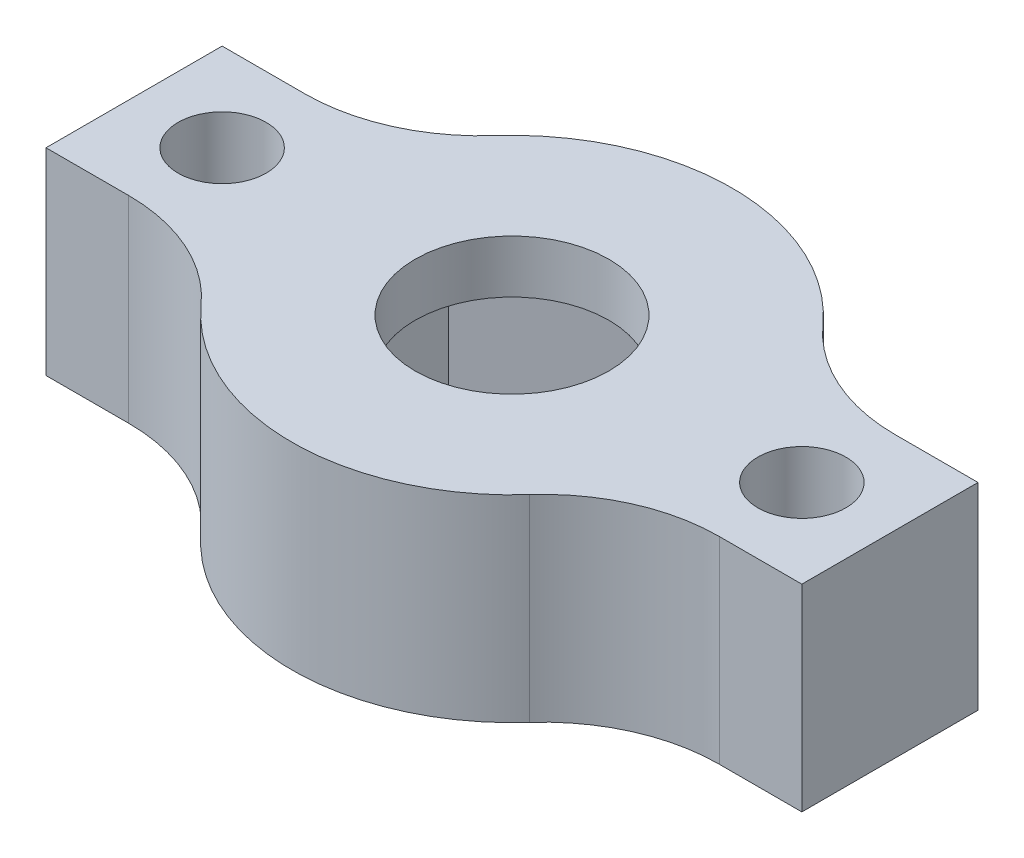
ISO-10303-21;
HEADER;
FILE_DESCRIPTION(('STEP AP214'),'2;1');
FILE_NAME('part.step','',(''),(''),'','','');
FILE_SCHEMA(('AUTOMOTIVE_DESIGN { 1 0 10303 214 1 1 1 1 }'));
ENDSEC;
DATA;
#1=APPLICATION_CONTEXT('core data for automotive mechanical design processes');
#2=APPLICATION_PROTOCOL_DEFINITION('international standard','automotive_design',2000,#1);
#3=PRODUCT_CONTEXT('',#1,'mechanical');
#4=PRODUCT('Part','Part','',(#3));
#5=PRODUCT_RELATED_PRODUCT_CATEGORY('part','',(#4));
#6=PRODUCT_DEFINITION_FORMATION('','',#4);
#7=PRODUCT_DEFINITION_CONTEXT('part definition',#1,'design');
#8=PRODUCT_DEFINITION('design','',#6,#7);
#9=PRODUCT_DEFINITION_SHAPE('','',#8);
#10=(LENGTH_UNIT() NAMED_UNIT(*) SI_UNIT(.MILLI.,.METRE.));
#11=(NAMED_UNIT(*) PLANE_ANGLE_UNIT() SI_UNIT($,.RADIAN.));
#12=(NAMED_UNIT(*) SI_UNIT($,.STERADIAN.) SOLID_ANGLE_UNIT());
#13=UNCERTAINTY_MEASURE_WITH_UNIT(LENGTH_MEASURE(1.E-05),#10,'distance_accuracy_value','');
#14=(GEOMETRIC_REPRESENTATION_CONTEXT(3) GLOBAL_UNCERTAINTY_ASSIGNED_CONTEXT((#13)) GLOBAL_UNIT_ASSIGNED_CONTEXT((#10,
#11,#12)) REPRESENTATION_CONTEXT('',''));
#15=CARTESIAN_POINT('',(0.,0.,0.));
#16=DIRECTION('',(0.,0.,1.));
#17=DIRECTION('',(1.,0.,0.));
#18=AXIS2_PLACEMENT_3D('',#15,#16,#17);
#19=CARTESIAN_POINT('',(0.,8.2,0.));
#20=DIRECTION('',(0.,-1.,0.));
#21=DIRECTION('',(0.,0.,-1.));
#22=AXIS2_PLACEMENT_3D('',#19,#20,#21);
#23=CYLINDRICAL_SURFACE('',#22,12.5);
#24=CARTESIAN_POINT('',(0.,11.2,0.));
#25=DIRECTION('',(0.,1.,0.));
#26=DIRECTION('',(0.,0.,1.));
#27=AXIS2_PLACEMENT_3D('',#24,#25,#26);
#28=CIRCLE('',#27,12.5);
#29=CARTESIAN_POINT('',(9.31694990624912,11.2,-8.33333333333333));
#30=VERTEX_POINT('',#29);
#31=CARTESIAN_POINT('',(-9.31694990624912,11.2,-8.33333333333334));
#32=VERTEX_POINT('',#31);
#33=EDGE_CURVE('E213',#30,#32,#28,.T.);
#34=ORIENTED_EDGE('',*,*,#33,.F.);
#35=DIRECTION('',(0.,-1.,0.));
#36=VECTOR('',#35,1.);
#37=CARTESIAN_POINT('',(9.31694990624912,8.2,-8.33333333333333));
#38=LINE('',#37,#36);
#39=CARTESIAN_POINT('',(9.31694990624912,0.,-8.33333333333333));
#40=VERTEX_POINT('',#39);
#41=EDGE_CURVE('E270',#30,#40,#38,.T.);
#42=ORIENTED_EDGE('',*,*,#41,.T.);
#43=CARTESIAN_POINT('',(0.,0.,0.));
#44=DIRECTION('',(0.,1.,0.));
#45=DIRECTION('',(0.,0.,1.));
#46=AXIS2_PLACEMENT_3D('',#43,#44,#45);
#47=CIRCLE('',#46,12.5);
#48=CARTESIAN_POINT('',(-9.31694990624912,0.,-8.33333333333334));
#49=VERTEX_POINT('',#48);
#50=EDGE_CURVE('E267',#40,#49,#47,.T.);
#51=ORIENTED_EDGE('',*,*,#50,.T.);
#52=DIRECTION('',(0.,-1.,0.));
#53=VECTOR('',#52,1.);
#54=CARTESIAN_POINT('',(-9.31694990624912,8.2,-8.33333333333334));
#55=LINE('',#54,#53);
#56=EDGE_CURVE('E268',#49,#32,#55,.F.);
#57=ORIENTED_EDGE('',*,*,#56,.T.);
#58=EDGE_LOOP('',(#34,#42,#51,#57));
#59=FACE_BOUND('',#58,.T.);
#60=ADVANCED_FACE('F31',(#59),#23,.T.);
#61=CARTESIAN_POINT('',(0.,0.,0.));
#62=DIRECTION('',(0.,1.,0.));
#63=DIRECTION('',(0.,0.,1.));
#64=AXIS2_PLACEMENT_3D('',#61,#62,#63);
#65=PLANE('',#64);
#66=CARTESIAN_POINT('',(-16.4564392373896,0.,0.));
#67=DIRECTION('',(0.,1.,0.));
#68=DIRECTION('',(0.,0.,1.));
#69=AXIS2_PLACEMENT_3D('',#66,#67,#68);
#70=CIRCLE('',#69,2.5);
#71=CARTESIAN_POINT('',(-16.4564392373896,0.,2.5));
#72=VERTEX_POINT('',#71);
#73=EDGE_CURVE('E334',#72,#72,#70,.T.);
#74=ORIENTED_EDGE('',*,*,#73,.T.);
#75=EDGE_LOOP('',(#74));
#76=FACE_BOUND('',#75,.T.);
#77=CARTESIAN_POINT('',(16.4564392373896,0.,0.));
#78=DIRECTION('',(0.,1.,0.));
#79=DIRECTION('',(0.,0.,1.));
#80=AXIS2_PLACEMENT_3D('',#77,#78,#79);
#81=CIRCLE('',#80,2.5);
#82=CARTESIAN_POINT('',(16.4564392373896,0.,2.5));
#83=VERTEX_POINT('',#82);
#84=EDGE_CURVE('E329',#83,#83,#81,.T.);
#85=ORIENTED_EDGE('',*,*,#84,.T.);
#86=EDGE_LOOP('',(#85));
#87=FACE_BOUND('',#86,.T.);
#88=CARTESIAN_POINT('',(-9.31694990624912,0.,8.33333333333334));
#89=VERTEX_POINT('',#88);
#90=CARTESIAN_POINT('',(9.31694990624912,0.,8.33333333333333));
#91=VERTEX_POINT('',#90);
#92=EDGE_CURVE('E264',#89,#91,#47,.T.);
#93=ORIENTED_EDGE('',*,*,#92,.F.);
#94=CARTESIAN_POINT('',(-16.7705098312484,0.,15.));
#95=DIRECTION('',(0.,1.,0.));
#96=DIRECTION('',(0.,0.,1.));
#97=AXIS2_PLACEMENT_3D('',#94,#95,#96);
#98=CIRCLE('',#97,10.);
#99=CARTESIAN_POINT('',(-16.7705098312484,0.,5.));
#100=VERTEX_POINT('',#99);
#101=EDGE_CURVE('E293',#89,#100,#98,.T.);
#102=ORIENTED_EDGE('',*,*,#101,.T.);
#103=DIRECTION('',(-1.,0.,0.));
#104=VECTOR('',#103,1.);
#105=CARTESIAN_POINT('',(-11.4564392373896,0.,5.));
#106=LINE('',#105,#104);
#107=CARTESIAN_POINT('',(-21.4564392373896,0.,5.00000000000001));
#108=VERTEX_POINT('',#107);
#109=EDGE_CURVE('E187',#100,#108,#106,.T.);
#110=ORIENTED_EDGE('',*,*,#109,.T.);
#111=DIRECTION('',(0.,0.,-1.));
#112=VECTOR('',#111,1.);
#113=CARTESIAN_POINT('',(-21.4564392373896,0.,5.00000000000001));
#114=LINE('',#113,#112);
#115=CARTESIAN_POINT('',(-21.4564392373896,0.,-5.00000000000001));
#116=VERTEX_POINT('',#115);
#117=EDGE_CURVE('E183',#108,#116,#114,.T.);
#118=ORIENTED_EDGE('',*,*,#117,.T.);
#119=DIRECTION('',(1.,0.,0.));
#120=VECTOR('',#119,1.);
#121=CARTESIAN_POINT('',(-11.4564392373896,0.,-5.));
#122=LINE('',#121,#120);
#123=CARTESIAN_POINT('',(-16.7705098312484,0.,-5.));
#124=VERTEX_POINT('',#123);
#125=EDGE_CURVE('E174',#116,#124,#122,.T.);
#126=ORIENTED_EDGE('',*,*,#125,.T.);
#127=CARTESIAN_POINT('',(-16.7705098312484,0.,-15.));
#128=DIRECTION('',(0.,1.,0.));
#129=DIRECTION('',(0.,0.,1.));
#130=AXIS2_PLACEMENT_3D('',#127,#128,#129);
#131=CIRCLE('',#130,10.);
#132=EDGE_CURVE('E290',#124,#49,#131,.T.);
#133=ORIENTED_EDGE('',*,*,#132,.T.);
#134=ORIENTED_EDGE('',*,*,#50,.F.);
#135=CARTESIAN_POINT('',(16.7705098312484,0.,-15.));
#136=DIRECTION('',(0.,1.,0.));
#137=DIRECTION('',(0.,0.,1.));
#138=AXIS2_PLACEMENT_3D('',#135,#136,#137);
#139=CIRCLE('',#138,10.);
#140=CARTESIAN_POINT('',(16.7705098312484,0.,-5.));
#141=VERTEX_POINT('',#140);
#142=EDGE_CURVE('E286',#40,#141,#139,.T.);
#143=ORIENTED_EDGE('',*,*,#142,.T.);
#144=DIRECTION('',(1.,0.,0.));
#145=VECTOR('',#144,1.);
#146=CARTESIAN_POINT('',(11.4564392373896,0.,-5.));
#147=LINE('',#146,#145);
#148=CARTESIAN_POINT('',(21.4564392373896,0.,-5.));
#149=VERTEX_POINT('',#148);
#150=EDGE_CURVE('E191',#141,#149,#147,.T.);
#151=ORIENTED_EDGE('',*,*,#150,.T.);
#152=DIRECTION('',(0.,0.,1.));
#153=VECTOR('',#152,1.);
#154=CARTESIAN_POINT('',(21.4564392373896,0.,5.));
#155=LINE('',#154,#153);
#156=CARTESIAN_POINT('',(21.4564392373896,0.,5.));
#157=VERTEX_POINT('',#156);
#158=EDGE_CURVE('E196',#149,#157,#155,.T.);
#159=ORIENTED_EDGE('',*,*,#158,.T.);
#160=DIRECTION('',(-1.,0.,0.));
#161=VECTOR('',#160,1.);
#162=CARTESIAN_POINT('',(11.4564392373896,0.,5.));
#163=LINE('',#162,#161);
#164=CARTESIAN_POINT('',(16.7705098312484,0.,5.));
#165=VERTEX_POINT('',#164);
#166=EDGE_CURVE('E192',#157,#165,#163,.T.);
#167=ORIENTED_EDGE('',*,*,#166,.T.);
#168=CARTESIAN_POINT('',(16.7705098312484,0.,15.));
#169=DIRECTION('',(0.,1.,0.));
#170=DIRECTION('',(0.,0.,1.));
#171=AXIS2_PLACEMENT_3D('',#168,#169,#170);
#172=CIRCLE('',#171,10.);
#173=EDGE_CURVE('E39',#165,#91,#172,.T.);
#174=ORIENTED_EDGE('',*,*,#173,.T.);
#175=EDGE_LOOP('',(#93,#102,#110,#118,#126,#133,#134,#143,#151,#159,#167,#174));
#176=FACE_BOUND('',#175,.T.);
#177=DIRECTION('',(0.866025403784439,0.,-0.5));
#178=VECTOR('',#177,1.);
#179=CARTESIAN_POINT('',(0.,0.,9.81495457622364));
#180=LINE('',#179,#178);
#181=CARTESIAN_POINT('',(0.,0.,9.81495457622364));
#182=VERTEX_POINT('',#181);
#183=CARTESIAN_POINT('',(8.5,0.,4.90747728811182));
#184=VERTEX_POINT('',#183);
#185=EDGE_CURVE('E234',#182,#184,#180,.T.);
#186=ORIENTED_EDGE('',*,*,#185,.T.);
#187=DIRECTION('',(0.,0.,-1.));
#188=VECTOR('',#187,1.);
#189=CARTESIAN_POINT('',(8.5,0.,4.90747728811182));
#190=LINE('',#189,#188);
#191=CARTESIAN_POINT('',(8.5,0.,-4.90747728811182));
#192=VERTEX_POINT('',#191);
#193=EDGE_CURVE('E237',#184,#192,#190,.T.);
#194=ORIENTED_EDGE('',*,*,#193,.T.);
#195=DIRECTION('',(-0.866025403784439,0.,-0.5));
#196=VECTOR('',#195,1.);
#197=CARTESIAN_POINT('',(8.5,0.,-4.90747728811182));
#198=LINE('',#197,#196);
#199=CARTESIAN_POINT('',(0.,0.,-9.81495457622364));
#200=VERTEX_POINT('',#199);
#201=EDGE_CURVE('E240',#192,#200,#198,.T.);
#202=ORIENTED_EDGE('',*,*,#201,.T.);
#203=DIRECTION('',(-0.866025403784439,0.,0.5));
#204=VECTOR('',#203,1.);
#205=CARTESIAN_POINT('',(0.,0.,-9.81495457622364));
#206=LINE('',#205,#204);
#207=CARTESIAN_POINT('',(-8.5,0.,-4.90747728811182));
#208=VERTEX_POINT('',#207);
#209=EDGE_CURVE('E243',#200,#208,#206,.T.);
#210=ORIENTED_EDGE('',*,*,#209,.T.);
#211=DIRECTION('',(0.,0.,1.));
#212=VECTOR('',#211,1.);
#213=CARTESIAN_POINT('',(-8.5,0.,-4.90747728811182));
#214=LINE('',#213,#212);
#215=CARTESIAN_POINT('',(-8.5,0.,4.90747728811182));
#216=VERTEX_POINT('',#215);
#217=EDGE_CURVE('E246',#208,#216,#214,.T.);
#218=ORIENTED_EDGE('',*,*,#217,.T.);
#219=DIRECTION('',(0.866025403784439,0.,0.5));
#220=VECTOR('',#219,1.);
#221=CARTESIAN_POINT('',(-8.5,0.,4.90747728811182));
#222=LINE('',#221,#220);
#223=EDGE_CURVE('E218',#216,#182,#222,.T.);
#224=ORIENTED_EDGE('',*,*,#223,.T.);
#225=EDGE_LOOP('',(#186,#194,#202,#210,#218,#224));
#226=FACE_BOUND('',#225,.T.);
#227=ADVANCED_FACE('F298',(#76,#87,#176,#226),#65,.F.);
#228=CARTESIAN_POINT('',(-9.31694990624912,11.2,8.33333333333334));
#229=VERTEX_POINT('',#228);
#230=CARTESIAN_POINT('',(9.31694990624912,11.2,8.33333333333333));
#231=VERTEX_POINT('',#230);
#232=EDGE_CURVE('E204',#229,#231,#28,.T.);
#233=ORIENTED_EDGE('',*,*,#232,.F.);
#234=DIRECTION('',(0.,-1.,0.));
#235=VECTOR('',#234,1.);
#236=CARTESIAN_POINT('',(-9.31694990624912,8.2,8.33333333333334));
#237=LINE('',#236,#235);
#238=EDGE_CURVE('E279',#229,#89,#237,.T.);
#239=ORIENTED_EDGE('',*,*,#238,.T.);
#240=ORIENTED_EDGE('',*,*,#92,.T.);
#241=DIRECTION('',(0.,-1.,0.));
#242=VECTOR('',#241,1.);
#243=CARTESIAN_POINT('',(9.31694990624912,8.2,8.33333333333333));
#244=LINE('',#243,#242);
#245=EDGE_CURVE('E277',#91,#231,#244,.F.);
#246=ORIENTED_EDGE('',*,*,#245,.T.);
#247=EDGE_LOOP('',(#233,#239,#240,#246));
#248=FACE_BOUND('',#247,.T.);
#249=ADVANCED_FACE('F303',(#248),#23,.T.);
#250=CARTESIAN_POINT('',(0.,8.2,9.81495457622364));
#251=DIRECTION('',(-0.5,0.,-0.866025403784439));
#252=DIRECTION('',(-0.866025403784439,0.,0.5));
#253=AXIS2_PLACEMENT_3D('',#250,#251,#252);
#254=PLANE('',#253);
#255=ORIENTED_EDGE('',*,*,#185,.F.);
#256=DIRECTION('',(0.,-1.,0.));
#257=VECTOR('',#256,1.);
#258=CARTESIAN_POINT('',(0.,8.2,9.81495457622364));
#259=LINE('',#258,#257);
#260=CARTESIAN_POINT('',(0.,8.2,9.81495457622364));
#261=VERTEX_POINT('',#260);
#262=EDGE_CURVE('E233',#261,#182,#259,.T.);
#263=ORIENTED_EDGE('',*,*,#262,.F.);
#264=DIRECTION('',(0.866025403784439,0.,-0.5));
#265=VECTOR('',#264,1.);
#266=CARTESIAN_POINT('',(0.,8.2,9.81495457622364));
#267=LINE('',#266,#265);
#268=CARTESIAN_POINT('',(8.5,8.2,4.90747728811182));
#269=VERTEX_POINT('',#268);
#270=EDGE_CURVE('E214',#261,#269,#267,.T.);
#271=ORIENTED_EDGE('',*,*,#270,.T.);
#272=DIRECTION('',(0.,-1.,0.));
#273=VECTOR('',#272,1.);
#274=CARTESIAN_POINT('',(8.5,8.2,4.90747728811182));
#275=LINE('',#274,#273);
#276=EDGE_CURVE('E261',#269,#184,#275,.T.);
#277=ORIENTED_EDGE('',*,*,#276,.T.);
#278=EDGE_LOOP('',(#255,#263,#271,#277));
#279=FACE_BOUND('',#278,.T.);
#280=ADVANCED_FACE('F383',(#279),#254,.T.);
#281=CARTESIAN_POINT('',(8.5,8.2,4.90747728811182));
#282=DIRECTION('',(-1.,0.,0.));
#283=DIRECTION('',(0.,0.,1.));
#284=AXIS2_PLACEMENT_3D('',#281,#282,#283);
#285=PLANE('',#284);
#286=ORIENTED_EDGE('',*,*,#193,.F.);
#287=ORIENTED_EDGE('',*,*,#276,.F.);
#288=DIRECTION('',(0.,0.,-1.));
#289=VECTOR('',#288,1.);
#290=CARTESIAN_POINT('',(8.5,8.2,4.90747728811182));
#291=LINE('',#290,#289);
#292=CARTESIAN_POINT('',(8.5,8.2,-4.90747728811182));
#293=VERTEX_POINT('',#292);
#294=EDGE_CURVE('E217',#269,#293,#291,.T.);
#295=ORIENTED_EDGE('',*,*,#294,.T.);
#296=DIRECTION('',(0.,-1.,0.));
#297=VECTOR('',#296,1.);
#298=CARTESIAN_POINT('',(8.5,8.2,-4.90747728811182));
#299=LINE('',#298,#297);
#300=EDGE_CURVE('E259',#293,#192,#299,.T.);
#301=ORIENTED_EDGE('',*,*,#300,.T.);
#302=EDGE_LOOP('',(#286,#287,#295,#301));
#303=FACE_BOUND('',#302,.T.);
#304=ADVANCED_FACE('F387',(#303),#285,.T.);
#305=CARTESIAN_POINT('',(8.5,8.2,-4.90747728811182));
#306=DIRECTION('',(-0.5,0.,0.866025403784439));
#307=DIRECTION('',(0.866025403784439,0.,0.5));
#308=AXIS2_PLACEMENT_3D('',#305,#306,#307);
#309=PLANE('',#308);
#310=ORIENTED_EDGE('',*,*,#201,.F.);
#311=ORIENTED_EDGE('',*,*,#300,.F.);
#312=DIRECTION('',(-0.866025403784439,0.,-0.5));
#313=VECTOR('',#312,1.);
#314=CARTESIAN_POINT('',(8.5,8.2,-4.90747728811182));
#315=LINE('',#314,#313);
#316=CARTESIAN_POINT('',(0.,8.2,-9.81495457622364));
#317=VERTEX_POINT('',#316);
#318=EDGE_CURVE('E221',#293,#317,#315,.T.);
#319=ORIENTED_EDGE('',*,*,#318,.T.);
#320=DIRECTION('',(0.,-1.,0.));
#321=VECTOR('',#320,1.);
#322=CARTESIAN_POINT('',(0.,8.2,-9.81495457622364));
#323=LINE('',#322,#321);
#324=EDGE_CURVE('E257',#317,#200,#323,.T.);
#325=ORIENTED_EDGE('',*,*,#324,.T.);
#326=EDGE_LOOP('',(#310,#311,#319,#325));
#327=FACE_BOUND('',#326,.T.);
#328=ADVANCED_FACE('F393',(#327),#309,.T.);
#329=CARTESIAN_POINT('',(0.,8.2,-9.81495457622364));
#330=DIRECTION('',(0.5,0.,0.866025403784439));
#331=DIRECTION('',(0.866025403784439,0.,-0.5));
#332=AXIS2_PLACEMENT_3D('',#329,#330,#331);
#333=PLANE('',#332);
#334=ORIENTED_EDGE('',*,*,#209,.F.);
#335=ORIENTED_EDGE('',*,*,#324,.F.);
#336=DIRECTION('',(-0.866025403784439,0.,0.5));
#337=VECTOR('',#336,1.);
#338=CARTESIAN_POINT('',(0.,8.2,-9.81495457622364));
#339=LINE('',#338,#337);
#340=CARTESIAN_POINT('',(-8.5,8.2,-4.90747728811182));
#341=VERTEX_POINT('',#340);
#342=EDGE_CURVE('E224',#317,#341,#339,.T.);
#343=ORIENTED_EDGE('',*,*,#342,.T.);
#344=DIRECTION('',(0.,-1.,0.));
#345=VECTOR('',#344,1.);
#346=CARTESIAN_POINT('',(-8.5,8.2,-4.90747728811182));
#347=LINE('',#346,#345);
#348=EDGE_CURVE('E255',#341,#208,#347,.T.);
#349=ORIENTED_EDGE('',*,*,#348,.T.);
#350=EDGE_LOOP('',(#334,#335,#343,#349));
#351=FACE_BOUND('',#350,.T.);
#352=ADVANCED_FACE('F399',(#351),#333,.T.);
#353=CARTESIAN_POINT('',(-8.5,8.2,-4.90747728811182));
#354=DIRECTION('',(1.,0.,0.));
#355=DIRECTION('',(0.,0.,-1.));
#356=AXIS2_PLACEMENT_3D('',#353,#354,#355);
#357=PLANE('',#356);
#358=ORIENTED_EDGE('',*,*,#217,.F.);
#359=ORIENTED_EDGE('',*,*,#348,.F.);
#360=DIRECTION('',(0.,0.,1.));
#361=VECTOR('',#360,1.);
#362=CARTESIAN_POINT('',(-8.5,8.2,-4.90747728811182));
#363=LINE('',#362,#361);
#364=CARTESIAN_POINT('',(-8.5,8.2,4.90747728811182));
#365=VERTEX_POINT('',#364);
#366=EDGE_CURVE('E227',#341,#365,#363,.T.);
#367=ORIENTED_EDGE('',*,*,#366,.T.);
#368=DIRECTION('',(0.,-1.,0.));
#369=VECTOR('',#368,1.);
#370=CARTESIAN_POINT('',(-8.5,8.2,4.90747728811182));
#371=LINE('',#370,#369);
#372=EDGE_CURVE('E253',#365,#216,#371,.T.);
#373=ORIENTED_EDGE('',*,*,#372,.T.);
#374=EDGE_LOOP('',(#358,#359,#367,#373));
#375=FACE_BOUND('',#374,.T.);
#376=ADVANCED_FACE('F403',(#375),#357,.T.);
#377=CARTESIAN_POINT('',(-8.5,8.2,4.90747728811182));
#378=DIRECTION('',(0.5,0.,-0.866025403784439));
#379=DIRECTION('',(-0.866025403784439,0.,-0.5));
#380=AXIS2_PLACEMENT_3D('',#377,#378,#379);
#381=PLANE('',#380);
#382=ORIENTED_EDGE('',*,*,#223,.F.);
#383=ORIENTED_EDGE('',*,*,#372,.F.);
#384=DIRECTION('',(0.866025403784439,0.,0.5));
#385=VECTOR('',#384,1.);
#386=CARTESIAN_POINT('',(-8.5,8.2,4.90747728811182));
#387=LINE('',#386,#385);
#388=EDGE_CURVE('E230',#365,#261,#387,.T.);
#389=ORIENTED_EDGE('',*,*,#388,.T.);
#390=ORIENTED_EDGE('',*,*,#262,.T.);
#391=EDGE_LOOP('',(#382,#383,#389,#390));
#392=FACE_BOUND('',#391,.T.);
#393=ADVANCED_FACE('F407',(#392),#381,.T.);
#394=CARTESIAN_POINT('',(0.,8.2,0.));
#395=DIRECTION('',(0.,1.,0.));
#396=DIRECTION('',(0.,0.,1.));
#397=AXIS2_PLACEMENT_3D('',#394,#395,#396);
#398=PLANE('',#397);
#399=CARTESIAN_POINT('',(0.,8.2,0.));
#400=DIRECTION('',(0.,1.,0.));
#401=DIRECTION('',(0.,0.,1.));
#402=AXIS2_PLACEMENT_3D('',#399,#400,#401);
#403=CIRCLE('',#402,5.5);
#404=CARTESIAN_POINT('',(0.,8.2,5.5));
#405=VERTEX_POINT('',#404);
#406=EDGE_CURVE('E340',#405,#405,#403,.T.);
#407=ORIENTED_EDGE('',*,*,#406,.T.);
#408=EDGE_LOOP('',(#407));
#409=FACE_BOUND('',#408,.T.);
#410=ORIENTED_EDGE('',*,*,#270,.F.);
#411=ORIENTED_EDGE('',*,*,#388,.F.);
#412=ORIENTED_EDGE('',*,*,#366,.F.);
#413=ORIENTED_EDGE('',*,*,#342,.F.);
#414=ORIENTED_EDGE('',*,*,#318,.F.);
#415=ORIENTED_EDGE('',*,*,#294,.F.);
#416=EDGE_LOOP('',(#410,#411,#412,#413,#414,#415));
#417=FACE_BOUND('',#416,.T.);
#418=ADVANCED_FACE('F354',(#409,#417),#398,.F.);
#419=CARTESIAN_POINT('',(0.,11.2,0.));
#420=DIRECTION('',(0.,1.,0.));
#421=DIRECTION('',(0.,0.,1.));
#422=AXIS2_PLACEMENT_3D('',#419,#420,#421);
#423=PLANE('',#422);
#424=CARTESIAN_POINT('',(0.,11.2,0.));
#425=DIRECTION('',(0.,1.,0.));
#426=DIRECTION('',(0.,0.,1.));
#427=AXIS2_PLACEMENT_3D('',#424,#425,#426);
#428=CIRCLE('',#427,5.5);
#429=CARTESIAN_POINT('',(0.,11.2,5.5));
#430=VERTEX_POINT('',#429);
#431=EDGE_CURVE('E345',#430,#430,#428,.T.);
#432=ORIENTED_EDGE('',*,*,#431,.F.);
#433=EDGE_LOOP('',(#432));
#434=FACE_BOUND('',#433,.T.);
#435=CARTESIAN_POINT('',(-16.4564392373896,11.2,0.));
#436=DIRECTION('',(0.,1.,0.));
#437=DIRECTION('',(0.,0.,1.));
#438=AXIS2_PLACEMENT_3D('',#435,#436,#437);
#439=CIRCLE('',#438,2.5);
#440=CARTESIAN_POINT('',(-16.4564392373896,11.2,2.5));
#441=VERTEX_POINT('',#440);
#442=EDGE_CURVE('E337',#441,#441,#439,.T.);
#443=ORIENTED_EDGE('',*,*,#442,.F.);
#444=EDGE_LOOP('',(#443));
#445=FACE_BOUND('',#444,.T.);
#446=CARTESIAN_POINT('',(16.4564392373896,11.2,0.));
#447=DIRECTION('',(0.,1.,0.));
#448=DIRECTION('',(0.,0.,1.));
#449=AXIS2_PLACEMENT_3D('',#446,#447,#448);
#450=CIRCLE('',#449,2.5);
#451=CARTESIAN_POINT('',(16.4564392373896,11.2,2.5));
#452=VERTEX_POINT('',#451);
#453=EDGE_CURVE('E331',#452,#452,#450,.T.);
#454=ORIENTED_EDGE('',*,*,#453,.F.);
#455=EDGE_LOOP('',(#454));
#456=FACE_BOUND('',#455,.T.);
#457=DIRECTION('',(1.,0.,0.));
#458=VECTOR('',#457,1.);
#459=CARTESIAN_POINT('',(11.4564392373896,11.2,-5.));
#460=LINE('',#459,#458);
#461=CARTESIAN_POINT('',(16.7705098312484,11.2,-5.));
#462=VERTEX_POINT('',#461);
#463=CARTESIAN_POINT('',(21.4564392373896,11.2,-5.));
#464=VERTEX_POINT('',#463);
#465=EDGE_CURVE('E195',#462,#464,#460,.T.);
#466=ORIENTED_EDGE('',*,*,#465,.F.);
#467=CARTESIAN_POINT('',(16.7705098312484,11.2,-15.));
#468=DIRECTION('',(0.,1.,0.));
#469=DIRECTION('',(0.,0.,1.));
#470=AXIS2_PLACEMENT_3D('',#467,#468,#469);
#471=CIRCLE('',#470,10.);
#472=EDGE_CURVE('E288',#462,#30,#471,.F.);
#473=ORIENTED_EDGE('',*,*,#472,.T.);
#474=ORIENTED_EDGE('',*,*,#33,.T.);
#475=CARTESIAN_POINT('',(-16.7705098312484,11.2,-15.));
#476=DIRECTION('',(0.,1.,0.));
#477=DIRECTION('',(0.,0.,1.));
#478=AXIS2_PLACEMENT_3D('',#475,#476,#477);
#479=CIRCLE('',#478,10.);
#480=CARTESIAN_POINT('',(-16.7705098312484,11.2,-5.));
#481=VERTEX_POINT('',#480);
#482=EDGE_CURVE('E164',#32,#481,#479,.F.);
#483=ORIENTED_EDGE('',*,*,#482,.T.);
#484=DIRECTION('',(1.,0.,0.));
#485=VECTOR('',#484,1.);
#486=CARTESIAN_POINT('',(-11.4564392373896,11.2,-5.));
#487=LINE('',#486,#485);
#488=CARTESIAN_POINT('',(-21.4564392373896,11.2,-5.00000000000001));
#489=VERTEX_POINT('',#488);
#490=EDGE_CURVE('E154',#489,#481,#487,.T.);
#491=ORIENTED_EDGE('',*,*,#490,.F.);
#492=DIRECTION('',(0.,0.,-1.));
#493=VECTOR('',#492,1.);
#494=CARTESIAN_POINT('',(-21.4564392373896,11.2,5.00000000000001));
#495=LINE('',#494,#493);
#496=CARTESIAN_POINT('',(-21.4564392373896,11.2,5.00000000000001));
#497=VERTEX_POINT('',#496);
#498=EDGE_CURVE('E160',#497,#489,#495,.T.);
#499=ORIENTED_EDGE('',*,*,#498,.F.);
#500=DIRECTION('',(-1.,0.,0.));
#501=VECTOR('',#500,1.);
#502=CARTESIAN_POINT('',(-11.4564392373896,11.2,5.));
#503=LINE('',#502,#501);
#504=CARTESIAN_POINT('',(-16.7705098312484,11.2,5.));
#505=VERTEX_POINT('',#504);
#506=EDGE_CURVE('E168',#505,#497,#503,.T.);
#507=ORIENTED_EDGE('',*,*,#506,.F.);
#508=CARTESIAN_POINT('',(-16.7705098312484,11.2,15.));
#509=DIRECTION('',(0.,1.,0.));
#510=DIRECTION('',(0.,0.,1.));
#511=AXIS2_PLACEMENT_3D('',#508,#509,#510);
#512=CIRCLE('',#511,10.);
#513=EDGE_CURVE('E295',#505,#229,#512,.F.);
#514=ORIENTED_EDGE('',*,*,#513,.T.);
#515=ORIENTED_EDGE('',*,*,#232,.T.);
#516=CARTESIAN_POINT('',(16.7705098312484,11.2,15.));
#517=DIRECTION('',(0.,1.,0.));
#518=DIRECTION('',(0.,0.,1.));
#519=AXIS2_PLACEMENT_3D('',#516,#517,#518);
#520=CIRCLE('',#519,10.);
#521=CARTESIAN_POINT('',(16.7705098312484,11.2,5.));
#522=VERTEX_POINT('',#521);
#523=EDGE_CURVE('E11',#231,#522,#520,.F.);
#524=ORIENTED_EDGE('',*,*,#523,.T.);
#525=DIRECTION('',(-1.,0.,0.));
#526=VECTOR('',#525,1.);
#527=CARTESIAN_POINT('',(11.4564392373896,11.2,5.));
#528=LINE('',#527,#526);
#529=CARTESIAN_POINT('',(21.4564392373896,11.2,5.));
#530=VERTEX_POINT('',#529);
#531=EDGE_CURVE('E202',#530,#522,#528,.T.);
#532=ORIENTED_EDGE('',*,*,#531,.F.);
#533=DIRECTION('',(0.,0.,1.));
#534=VECTOR('',#533,1.);
#535=CARTESIAN_POINT('',(21.4564392373896,11.2,5.));
#536=LINE('',#535,#534);
#537=EDGE_CURVE('E206',#464,#530,#536,.T.);
#538=ORIENTED_EDGE('',*,*,#537,.F.);
#539=EDGE_LOOP('',(#466,#473,#474,#483,#491,#499,#507,#514,#515,#524,#532,#538));
#540=FACE_BOUND('',#539,.T.);
#541=ADVANCED_FACE('F157',(#434,#445,#456,#540),#423,.T.);
#542=CARTESIAN_POINT('',(11.4564392373896,25.342135623731,-5.));
#543=DIRECTION('',(0.,0.,-1.));
#544=DIRECTION('',(-1.,0.,0.));
#545=AXIS2_PLACEMENT_3D('',#542,#543,#544);
#546=PLANE('',#545);
#547=ORIENTED_EDGE('',*,*,#150,.F.);
#548=DIRECTION('',(0.,-1.,0.));
#549=VECTOR('',#548,1.);
#550=CARTESIAN_POINT('',(16.7705098312484,25.342135623731,-5.));
#551=LINE('',#550,#549);
#552=EDGE_CURVE('E273',#141,#462,#551,.F.);
#553=ORIENTED_EDGE('',*,*,#552,.T.);
#554=ORIENTED_EDGE('',*,*,#465,.T.);
#555=DIRECTION('',(0.,-1.,0.));
#556=VECTOR('',#555,1.);
#557=CARTESIAN_POINT('',(21.4564392373896,25.342135623731,-5.));
#558=LINE('',#557,#556);
#559=EDGE_CURVE('E201',#464,#149,#558,.T.);
#560=ORIENTED_EDGE('',*,*,#559,.T.);
#561=EDGE_LOOP('',(#547,#553,#554,#560));
#562=FACE_BOUND('',#561,.T.);
#563=ADVANCED_FACE('F316',(#562),#546,.T.);
#564=CARTESIAN_POINT('',(21.4564392373896,25.342135623731,5.));
#565=DIRECTION('',(1.,0.,0.));
#566=DIRECTION('',(0.,0.,-1.));
#567=AXIS2_PLACEMENT_3D('',#564,#565,#566);
#568=PLANE('',#567);
#569=ORIENTED_EDGE('',*,*,#559,.F.);
#570=ORIENTED_EDGE('',*,*,#537,.T.);
#571=DIRECTION('',(0.,-1.,0.));
#572=VECTOR('',#571,1.);
#573=CARTESIAN_POINT('',(21.4564392373896,25.342135623731,5.));
#574=LINE('',#573,#572);
#575=EDGE_CURVE('E205',#530,#157,#574,.T.);
#576=ORIENTED_EDGE('',*,*,#575,.T.);
#577=ORIENTED_EDGE('',*,*,#158,.F.);
#578=EDGE_LOOP('',(#569,#570,#576,#577));
#579=FACE_BOUND('',#578,.T.);
#580=ADVANCED_FACE('F313',(#579),#568,.T.);
#581=CARTESIAN_POINT('',(11.4564392373896,25.342135623731,5.));
#582=DIRECTION('',(0.,0.,1.));
#583=DIRECTION('',(1.,0.,0.));
#584=AXIS2_PLACEMENT_3D('',#581,#582,#583);
#585=PLANE('',#584);
#586=ORIENTED_EDGE('',*,*,#531,.T.);
#587=DIRECTION('',(0.,-1.,0.));
#588=VECTOR('',#587,1.);
#589=CARTESIAN_POINT('',(16.7705098312484,25.342135623731,5.));
#590=LINE('',#589,#588);
#591=EDGE_CURVE('E284',#522,#165,#590,.T.);
#592=ORIENTED_EDGE('',*,*,#591,.T.);
#593=ORIENTED_EDGE('',*,*,#166,.F.);
#594=ORIENTED_EDGE('',*,*,#575,.F.);
#595=EDGE_LOOP('',(#586,#592,#593,#594));
#596=FACE_BOUND('',#595,.T.);
#597=ADVANCED_FACE('F306',(#596),#585,.T.);
#598=CARTESIAN_POINT('',(-21.4564392373896,25.342135623731,5.00000000000001));
#599=DIRECTION('',(-1.,0.,0.));
#600=DIRECTION('',(0.,0.,1.));
#601=AXIS2_PLACEMENT_3D('',#598,#599,#600);
#602=PLANE('',#601);
#603=DIRECTION('',(0.,-1.,0.));
#604=VECTOR('',#603,1.);
#605=CARTESIAN_POINT('',(-21.4564392373896,25.342135623731,5.00000000000001));
#606=LINE('',#605,#604);
#607=EDGE_CURVE('E181',#497,#108,#606,.T.);
#608=ORIENTED_EDGE('',*,*,#607,.F.);
#609=ORIENTED_EDGE('',*,*,#498,.T.);
#610=DIRECTION('',(0.,-1.,0.));
#611=VECTOR('',#610,1.);
#612=CARTESIAN_POINT('',(-21.4564392373896,25.342135623731,-5.00000000000001));
#613=LINE('',#612,#611);
#614=EDGE_CURVE('E169',#489,#116,#613,.T.);
#615=ORIENTED_EDGE('',*,*,#614,.T.);
#616=ORIENTED_EDGE('',*,*,#117,.F.);
#617=EDGE_LOOP('',(#608,#609,#615,#616));
#618=FACE_BOUND('',#617,.T.);
#619=ADVANCED_FACE('F179',(#618),#602,.T.);
#620=CARTESIAN_POINT('',(-11.4564392373896,25.342135623731,-5.));
#621=DIRECTION('',(0.,0.,-1.));
#622=DIRECTION('',(-1.,0.,0.));
#623=AXIS2_PLACEMENT_3D('',#620,#621,#622);
#624=PLANE('',#623);
#625=ORIENTED_EDGE('',*,*,#490,.T.);
#626=DIRECTION('',(0.,-1.,0.));
#627=VECTOR('',#626,1.);
#628=CARTESIAN_POINT('',(-16.7705098312484,25.342135623731,-5.));
#629=LINE('',#628,#627);
#630=EDGE_CURVE('E275',#481,#124,#629,.T.);
#631=ORIENTED_EDGE('',*,*,#630,.T.);
#632=ORIENTED_EDGE('',*,*,#125,.F.);
#633=ORIENTED_EDGE('',*,*,#614,.F.);
#634=EDGE_LOOP('',(#625,#631,#632,#633));
#635=FACE_BOUND('',#634,.T.);
#636=ADVANCED_FACE('F172',(#635),#624,.T.);
#637=CARTESIAN_POINT('',(-11.4564392373896,25.342135623731,5.));
#638=DIRECTION('',(0.,0.,1.));
#639=DIRECTION('',(1.,0.,0.));
#640=AXIS2_PLACEMENT_3D('',#637,#638,#639);
#641=PLANE('',#640);
#642=ORIENTED_EDGE('',*,*,#109,.F.);
#643=DIRECTION('',(0.,-1.,0.));
#644=VECTOR('',#643,1.);
#645=CARTESIAN_POINT('',(-16.7705098312484,25.342135623731,5.));
#646=LINE('',#645,#644);
#647=EDGE_CURVE('E282',#100,#505,#646,.F.);
#648=ORIENTED_EDGE('',*,*,#647,.T.);
#649=ORIENTED_EDGE('',*,*,#506,.T.);
#650=ORIENTED_EDGE('',*,*,#607,.T.);
#651=EDGE_LOOP('',(#642,#648,#649,#650));
#652=FACE_BOUND('',#651,.T.);
#653=ADVANCED_FACE('F424',(#652),#641,.T.);
#654=CARTESIAN_POINT('',(16.7705098312484,8.2,-15.));
#655=DIRECTION('',(0.,-1.,0.));
#656=DIRECTION('',(0.,0.,-1.));
#657=AXIS2_PLACEMENT_3D('',#654,#655,#656);
#658=CYLINDRICAL_SURFACE('',#657,10.);
#659=ORIENTED_EDGE('',*,*,#472,.F.);
#660=ORIENTED_EDGE('',*,*,#552,.F.);
#661=ORIENTED_EDGE('',*,*,#142,.F.);
#662=ORIENTED_EDGE('',*,*,#41,.F.);
#663=EDGE_LOOP('',(#659,#660,#661,#662));
#664=FACE_BOUND('',#663,.T.);
#665=ADVANCED_FACE('F319',(#664),#658,.F.);
#666=CARTESIAN_POINT('',(-16.7705098312484,8.2,-15.));
#667=DIRECTION('',(0.,-1.,0.));
#668=DIRECTION('',(0.,0.,-1.));
#669=AXIS2_PLACEMENT_3D('',#666,#667,#668);
#670=CYLINDRICAL_SURFACE('',#669,10.);
#671=ORIENTED_EDGE('',*,*,#482,.F.);
#672=ORIENTED_EDGE('',*,*,#56,.F.);
#673=ORIENTED_EDGE('',*,*,#132,.F.);
#674=ORIENTED_EDGE('',*,*,#630,.F.);
#675=EDGE_LOOP('',(#671,#672,#673,#674));
#676=FACE_BOUND('',#675,.T.);
#677=ADVANCED_FACE('F327',(#676),#670,.F.);
#678=CARTESIAN_POINT('',(-16.7705098312484,8.2,15.));
#679=DIRECTION('',(0.,-1.,0.));
#680=DIRECTION('',(0.,0.,-1.));
#681=AXIS2_PLACEMENT_3D('',#678,#679,#680);
#682=CYLINDRICAL_SURFACE('',#681,10.);
#683=ORIENTED_EDGE('',*,*,#513,.F.);
#684=ORIENTED_EDGE('',*,*,#647,.F.);
#685=ORIENTED_EDGE('',*,*,#101,.F.);
#686=ORIENTED_EDGE('',*,*,#238,.F.);
#687=EDGE_LOOP('',(#683,#684,#685,#686));
#688=FACE_BOUND('',#687,.T.);
#689=ADVANCED_FACE('F371',(#688),#682,.F.);
#690=CARTESIAN_POINT('',(16.7705098312484,8.2,15.));
#691=DIRECTION('',(0.,-1.,0.));
#692=DIRECTION('',(0.,0.,-1.));
#693=AXIS2_PLACEMENT_3D('',#690,#691,#692);
#694=CYLINDRICAL_SURFACE('',#693,10.);
#695=ORIENTED_EDGE('',*,*,#523,.F.);
#696=ORIENTED_EDGE('',*,*,#245,.F.);
#697=ORIENTED_EDGE('',*,*,#173,.F.);
#698=ORIENTED_EDGE('',*,*,#591,.F.);
#699=EDGE_LOOP('',(#695,#696,#697,#698));
#700=FACE_BOUND('',#699,.T.);
#701=ADVANCED_FACE('F33',(#700),#694,.F.);
#702=CARTESIAN_POINT('',(16.4564392373896,0.,0.));
#703=DIRECTION('',(0.,1.,0.));
#704=DIRECTION('',(0.,0.,1.));
#705=AXIS2_PLACEMENT_3D('',#702,#703,#704);
#706=CYLINDRICAL_SURFACE('',#705,2.5);
#707=ORIENTED_EDGE('',*,*,#84,.F.);
#708=EDGE_LOOP('',(#707));
#709=FACE_BOUND('',#708,.T.);
#710=ORIENTED_EDGE('',*,*,#453,.T.);
#711=EDGE_LOOP('',(#710));
#712=FACE_BOUND('',#711,.T.);
#713=ADVANCED_FACE('F360',(#709,#712),#706,.F.);
#714=CARTESIAN_POINT('',(-16.4564392373896,0.,0.));
#715=DIRECTION('',(0.,1.,0.));
#716=DIRECTION('',(0.,0.,1.));
#717=AXIS2_PLACEMENT_3D('',#714,#715,#716);
#718=CYLINDRICAL_SURFACE('',#717,2.5);
#719=ORIENTED_EDGE('',*,*,#73,.F.);
#720=EDGE_LOOP('',(#719));
#721=FACE_BOUND('',#720,.T.);
#722=ORIENTED_EDGE('',*,*,#442,.T.);
#723=EDGE_LOOP('',(#722));
#724=FACE_BOUND('',#723,.T.);
#725=ADVANCED_FACE('F362',(#721,#724),#718,.F.);
#726=CARTESIAN_POINT('',(0.,7.2,0.));
#727=DIRECTION('',(0.,1.,0.));
#728=DIRECTION('',(0.,0.,1.));
#729=AXIS2_PLACEMENT_3D('',#726,#727,#728);
#730=CYLINDRICAL_SURFACE('',#729,5.5);
#731=ORIENTED_EDGE('',*,*,#431,.T.);
#732=EDGE_LOOP('',(#731));
#733=FACE_BOUND('',#732,.T.);
#734=ORIENTED_EDGE('',*,*,#406,.F.);
#735=EDGE_LOOP('',(#734));
#736=FACE_BOUND('',#735,.T.);
#737=ADVANCED_FACE('F349',(#733,#736),#730,.F.);
#738=CLOSED_SHELL('',(#60,#227,#249,#280,#304,#328,#352,#376,#393,#418,#541,#563,#580,#597,#619,
#636,#653,#665,#677,#689,#701,#713,#725,#737));
#739=MANIFOLD_SOLID_BREP('B2',#738);
#740=ADVANCED_BREP_SHAPE_REPRESENTATION('',(#18,#739),#14);
#741=SHAPE_DEFINITION_REPRESENTATION(#9,#740);
ENDSEC;
END-ISO-10303-21;
